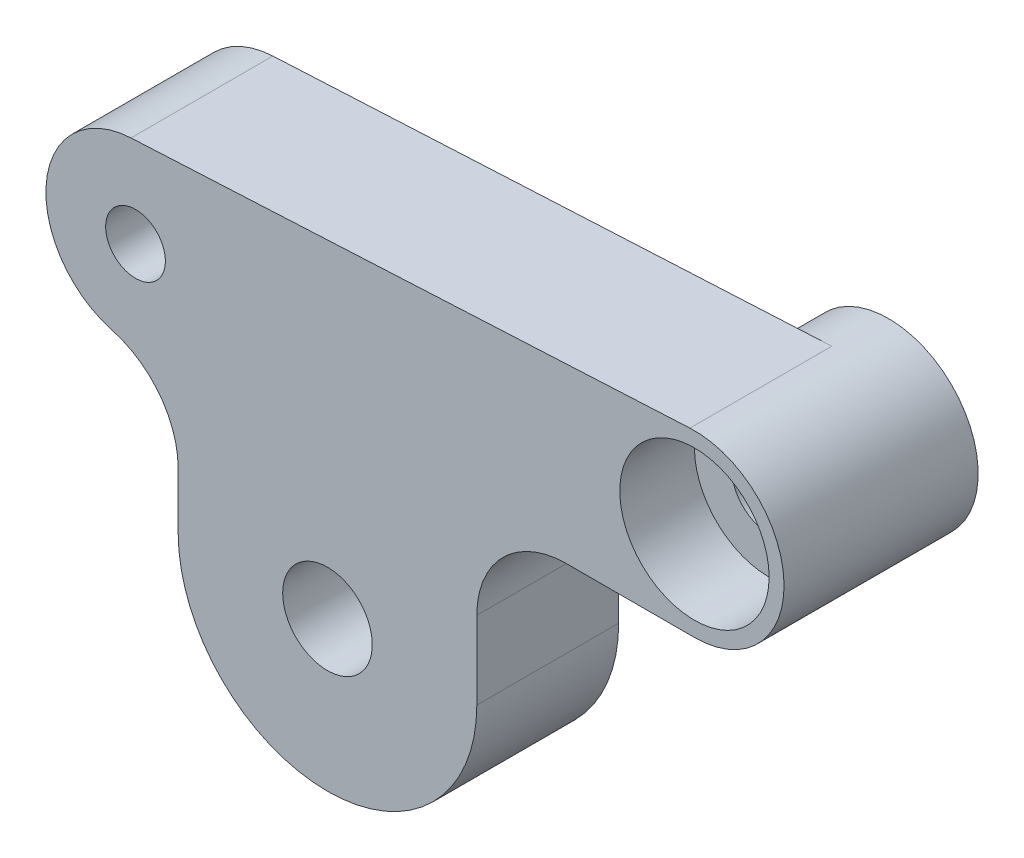
ISO-10303-21;
HEADER;
FILE_DESCRIPTION(('STEP AP214'),'2;1');
FILE_NAME('part.step','',(''),(''),'','','');
FILE_SCHEMA(('AUTOMOTIVE_DESIGN { 1 0 10303 214 1 1 1 1 }'));
ENDSEC;
DATA;
#1=APPLICATION_CONTEXT('core data for automotive mechanical design processes');
#2=APPLICATION_PROTOCOL_DEFINITION('international standard','automotive_design',2000,#1);
#3=PRODUCT_CONTEXT('',#1,'mechanical');
#4=PRODUCT('Part','Part','',(#3));
#5=PRODUCT_RELATED_PRODUCT_CATEGORY('part','',(#4));
#6=PRODUCT_DEFINITION_FORMATION('','',#4);
#7=PRODUCT_DEFINITION_CONTEXT('part definition',#1,'design');
#8=PRODUCT_DEFINITION('design','',#6,#7);
#9=PRODUCT_DEFINITION_SHAPE('','',#8);
#10=(LENGTH_UNIT() NAMED_UNIT(*) SI_UNIT(.MILLI.,.METRE.));
#11=(NAMED_UNIT(*) PLANE_ANGLE_UNIT() SI_UNIT($,.RADIAN.));
#12=(NAMED_UNIT(*) SI_UNIT($,.STERADIAN.) SOLID_ANGLE_UNIT());
#13=UNCERTAINTY_MEASURE_WITH_UNIT(LENGTH_MEASURE(1.E-05),#10,'distance_accuracy_value','');
#14=(GEOMETRIC_REPRESENTATION_CONTEXT(3) GLOBAL_UNCERTAINTY_ASSIGNED_CONTEXT((#13)) GLOBAL_UNIT_ASSIGNED_CONTEXT((#10,
#11,#12)) REPRESENTATION_CONTEXT('',''));
#15=CARTESIAN_POINT('',(0.,0.,0.));
#16=DIRECTION('',(0.,0.,1.));
#17=DIRECTION('',(1.,0.,0.));
#18=AXIS2_PLACEMENT_3D('',#15,#16,#17);
#19=CARTESIAN_POINT('',(-12.8557521937228,15.3208888623776,9.5));
#20=DIRECTION('',(0.,0.,-1.));
#21=DIRECTION('',(-1.,0.,0.));
#22=AXIS2_PLACEMENT_3D('',#19,#20,#21);
#23=CYLINDRICAL_SURFACE('',#22,2.);
#24=CARTESIAN_POINT('',(-12.8557521937228,15.3208888623776,9.5));
#25=DIRECTION('',(0.,0.,-1.));
#26=DIRECTION('',(-1.,0.,0.));
#27=AXIS2_PLACEMENT_3D('',#24,#25,#26);
#28=CIRCLE('',#27,2.);
#29=CARTESIAN_POINT('',(-14.8557521937228,15.3208888623776,9.5));
#30=VERTEX_POINT('',#29);
#31=EDGE_CURVE('E198',#30,#30,#28,.T.);
#32=ORIENTED_EDGE('',*,*,#31,.F.);
#33=EDGE_LOOP('',(#32));
#34=FACE_BOUND('',#33,.T.);
#35=CARTESIAN_POINT('',(-12.8557521937228,15.3208888623776,6.));
#36=DIRECTION('',(0.,0.,-1.));
#37=DIRECTION('',(-1.,0.,0.));
#38=AXIS2_PLACEMENT_3D('',#35,#36,#37);
#39=CIRCLE('',#38,2.);
#40=CARTESIAN_POINT('',(-14.8557521937228,15.3208888623776,6.));
#41=VERTEX_POINT('',#40);
#42=EDGE_CURVE('E196',#41,#41,#39,.F.);
#43=ORIENTED_EDGE('',*,*,#42,.F.);
#44=EDGE_LOOP('',(#43));
#45=FACE_BOUND('',#44,.T.);
#46=ADVANCED_FACE('F49',(#34,#45),#23,.F.);
#47=CARTESIAN_POINT('',(0.,0.,9.5));
#48=DIRECTION('',(0.,0.,-1.));
#49=DIRECTION('',(-1.,0.,0.));
#50=AXIS2_PLACEMENT_3D('',#47,#48,#49);
#51=CYLINDRICAL_SURFACE('',#50,10.);
#52=CARTESIAN_POINT('',(0.,0.,0.));
#53=DIRECTION('',(0.,0.,1.));
#54=DIRECTION('',(1.,0.,0.));
#55=AXIS2_PLACEMENT_3D('',#52,#53,#54);
#56=CIRCLE('',#55,10.);
#57=CARTESIAN_POINT('',(-10.,0.,0.));
#58=VERTEX_POINT('',#57);
#59=CARTESIAN_POINT('',(10.,0.,0.));
#60=VERTEX_POINT('',#59);
#61=EDGE_CURVE('E159',#58,#60,#56,.T.);
#62=ORIENTED_EDGE('',*,*,#61,.T.);
#63=DIRECTION('',(0.,0.,-1.));
#64=VECTOR('',#63,1.);
#65=CARTESIAN_POINT('',(10.,0.,9.5));
#66=LINE('',#65,#64);
#67=CARTESIAN_POINT('',(10.,0.,9.5));
#68=VERTEX_POINT('',#67);
#69=EDGE_CURVE('E145',#68,#60,#66,.T.);
#70=ORIENTED_EDGE('',*,*,#69,.F.);
#71=CARTESIAN_POINT('',(0.,0.,9.5));
#72=DIRECTION('',(0.,0.,1.));
#73=DIRECTION('',(1.,0.,0.));
#74=AXIS2_PLACEMENT_3D('',#71,#72,#73);
#75=CIRCLE('',#74,10.);
#76=CARTESIAN_POINT('',(-10.,0.,9.5));
#77=VERTEX_POINT('',#76);
#78=EDGE_CURVE('E163',#77,#68,#75,.T.);
#79=ORIENTED_EDGE('',*,*,#78,.F.);
#80=DIRECTION('',(0.,0.,-1.));
#81=VECTOR('',#80,1.);
#82=CARTESIAN_POINT('',(-10.,0.,9.5));
#83=LINE('',#82,#81);
#84=EDGE_CURVE('E179',#77,#58,#83,.T.);
#85=ORIENTED_EDGE('',*,*,#84,.T.);
#86=EDGE_LOOP('',(#62,#70,#79,#85));
#87=FACE_BOUND('',#86,.T.);
#88=ADVANCED_FACE('F236',(#87),#51,.T.);
#89=CARTESIAN_POINT('',(10.,0.,9.5));
#90=DIRECTION('',(-1.,0.,0.));
#91=DIRECTION('',(0.,0.,1.));
#92=AXIS2_PLACEMENT_3D('',#89,#90,#91);
#93=PLANE('',#92);
#94=DIRECTION('',(0.,1.,0.));
#95=VECTOR('',#94,1.);
#96=CARTESIAN_POINT('',(10.,0.,0.));
#97=LINE('',#96,#95);
#98=CARTESIAN_POINT('',(10.,5.20729309053141,0.));
#99=VERTEX_POINT('',#98);
#100=EDGE_CURVE('E182',#60,#99,#97,.T.);
#101=ORIENTED_EDGE('',*,*,#100,.T.);
#102=DIRECTION('',(0.,0.,-1.));
#103=VECTOR('',#102,1.);
#104=CARTESIAN_POINT('',(10.,5.20729309053141,9.5));
#105=LINE('',#104,#103);
#106=CARTESIAN_POINT('',(10.,5.20729309053141,9.5));
#107=VERTEX_POINT('',#106);
#108=EDGE_CURVE('E64',#99,#107,#105,.F.);
#109=ORIENTED_EDGE('',*,*,#108,.T.);
#110=DIRECTION('',(0.,1.,0.));
#111=VECTOR('',#110,1.);
#112=CARTESIAN_POINT('',(10.,0.,9.5));
#113=LINE('',#112,#111);
#114=EDGE_CURVE('E166',#68,#107,#113,.T.);
#115=ORIENTED_EDGE('',*,*,#114,.F.);
#116=ORIENTED_EDGE('',*,*,#69,.T.);
#117=EDGE_LOOP('',(#101,#109,#115,#116));
#118=FACE_BOUND('',#117,.T.);
#119=ADVANCED_FACE('F244',(#118),#93,.F.);
#120=CARTESIAN_POINT('',(10.,11.2072930905314,9.5));
#121=DIRECTION('',(0.,1.,0.));
#122=DIRECTION('',(0.,0.,1.));
#123=AXIS2_PLACEMENT_3D('',#120,#121,#122);
#124=PLANE('',#123);
#125=DIRECTION('',(1.,0.,0.));
#126=VECTOR('',#125,1.);
#127=CARTESIAN_POINT('',(10.,11.2072930905314,9.5));
#128=LINE('',#127,#126);
#129=CARTESIAN_POINT('',(16.,11.2072930905314,9.5));
#130=VERTEX_POINT('',#129);
#131=CARTESIAN_POINT('',(24.5745613286697,11.2072930905314,9.5));
#132=VERTEX_POINT('',#131);
#133=EDGE_CURVE('E169',#130,#132,#128,.T.);
#134=ORIENTED_EDGE('',*,*,#133,.F.);
#135=DIRECTION('',(0.,0.,-1.));
#136=VECTOR('',#135,1.);
#137=CARTESIAN_POINT('',(16.,11.2072930905314,0.));
#138=LINE('',#137,#136);
#139=CARTESIAN_POINT('',(16.,11.2072930905314,0.));
#140=VERTEX_POINT('',#139);
#141=EDGE_CURVE('E202',#130,#140,#138,.T.);
#142=ORIENTED_EDGE('',*,*,#141,.T.);
#143=DIRECTION('',(1.,0.,0.));
#144=VECTOR('',#143,1.);
#145=CARTESIAN_POINT('',(10.,11.2072930905314,0.));
#146=LINE('',#145,#144);
#147=CARTESIAN_POINT('',(24.5745613286697,11.2072930905314,0.));
#148=VERTEX_POINT('',#147);
#149=EDGE_CURVE('E129',#140,#148,#146,.T.);
#150=ORIENTED_EDGE('',*,*,#149,.T.);
#151=DIRECTION('',(0.,0.,-1.));
#152=VECTOR('',#151,1.);
#153=CARTESIAN_POINT('',(24.5745613286697,11.2072930905314,9.5));
#154=LINE('',#153,#152);
#155=EDGE_CURVE('E138',#132,#148,#154,.T.);
#156=ORIENTED_EDGE('',*,*,#155,.F.);
#157=EDGE_LOOP('',(#134,#142,#150,#156));
#158=FACE_BOUND('',#157,.T.);
#159=ADVANCED_FACE('F301',(#158),#124,.F.);
#160=CARTESIAN_POINT('',(24.5745613286697,17.2072930905314,9.5));
#161=DIRECTION('',(0.,0.,-1.));
#162=DIRECTION('',(-1.,0.,0.));
#163=AXIS2_PLACEMENT_3D('',#160,#161,#162);
#164=CYLINDRICAL_SURFACE('',#163,6.);
#165=ORIENTED_EDGE('',*,*,#155,.T.);
#166=CARTESIAN_POINT('',(24.5745613286697,17.2072930905314,0.));
#167=DIRECTION('',(0.,0.,-1.));
#168=DIRECTION('',(-1.,0.,0.));
#169=AXIS2_PLACEMENT_3D('',#166,#167,#168);
#170=CIRCLE('',#169,6.00000000000195);
#171=CARTESIAN_POINT('',(24.2725580164583,23.19968777041,0.));
#172=VERTEX_POINT('',#171);
#173=EDGE_CURVE('E122',#148,#172,#170,.T.);
#174=ORIENTED_EDGE('',*,*,#173,.T.);
#175=DIRECTION('',(0.,0.,-1.));
#176=VECTOR('',#175,1.);
#177=CARTESIAN_POINT('',(24.2725580164584,23.199687770408,9.5));
#178=LINE('',#177,#176);
#179=CARTESIAN_POINT('',(24.2725580164584,23.199687770408,9.5));
#180=VERTEX_POINT('',#179);
#181=EDGE_CURVE('E133',#180,#172,#178,.T.);
#182=ORIENTED_EDGE('',*,*,#181,.F.);
#183=CARTESIAN_POINT('',(24.5745613286697,17.2072930905314,9.5));
#184=DIRECTION('',(0.,0.,1.));
#185=DIRECTION('',(-1.,0.,0.));
#186=AXIS2_PLACEMENT_3D('',#183,#184,#185);
#187=CIRCLE('',#186,6.);
#188=EDGE_CURVE('E171',#132,#180,#187,.T.);
#189=ORIENTED_EDGE('',*,*,#188,.F.);
#190=EDGE_LOOP('',(#165,#174,#182,#189));
#191=FACE_BOUND('',#190,.T.);
#192=CARTESIAN_POINT('',(24.5745613286697,17.2072930905314,-3.5));
#193=DIRECTION('',(0.,0.,-1.));
#194=DIRECTION('',(-1.,0.,0.));
#195=AXIS2_PLACEMENT_3D('',#192,#193,#194);
#196=CIRCLE('',#195,6.00000000000195);
#197=CARTESIAN_POINT('',(18.5745613286678,17.2072930905314,-3.5));
#198=VERTEX_POINT('',#197);
#199=EDGE_CURVE('E154',#198,#198,#196,.T.);
#200=ORIENTED_EDGE('',*,*,#199,.F.);
#201=EDGE_LOOP('',(#200));
#202=FACE_BOUND('',#201,.T.);
#203=ADVANCED_FACE('F141',(#191,#202),#164,.T.);
#204=CARTESIAN_POINT('',(24.2725580164584,23.199687770408,9.5));
#205=DIRECTION('',(0.0503338853685589,-0.9987324466461,0.));
#206=DIRECTION('',(0.9987324466461,0.0503338853685589,0.));
#207=AXIS2_PLACEMENT_3D('',#204,#205,#206);
#208=PLANE('',#207);
#209=DIRECTION('',(-0.9987324466461,-0.0503338853685589,0.));
#210=VECTOR('',#209,1.);
#211=CARTESIAN_POINT('',(24.2725580164584,23.199687770408,0.));
#212=LINE('',#211,#210);
#213=CARTESIAN_POINT('',(-13.1577555059422,21.3132835422561,0.));
#214=VERTEX_POINT('',#213);
#215=EDGE_CURVE('E117',#172,#214,#212,.T.);
#216=ORIENTED_EDGE('',*,*,#215,.T.);
#217=DIRECTION('',(0.,0.,-1.));
#218=VECTOR('',#217,1.);
#219=CARTESIAN_POINT('',(-13.1577555059422,21.3132835422561,9.5));
#220=LINE('',#219,#218);
#221=CARTESIAN_POINT('',(-13.1577555059422,21.3132835422561,9.5));
#222=VERTEX_POINT('',#221);
#223=EDGE_CURVE('E139',#222,#214,#220,.T.);
#224=ORIENTED_EDGE('',*,*,#223,.F.);
#225=DIRECTION('',(-0.9987324466461,-0.0503338853685589,0.));
#226=VECTOR('',#225,1.);
#227=CARTESIAN_POINT('',(24.2725580164584,23.199687770408,9.5));
#228=LINE('',#227,#226);
#229=EDGE_CURVE('E135',#180,#222,#228,.T.);
#230=ORIENTED_EDGE('',*,*,#229,.F.);
#231=ORIENTED_EDGE('',*,*,#181,.T.);
#232=EDGE_LOOP('',(#216,#224,#230,#231));
#233=FACE_BOUND('',#232,.T.);
#234=ADVANCED_FACE('F134',(#233),#208,.F.);
#235=CARTESIAN_POINT('',(-12.8557521937309,15.3208888623795,9.5));
#236=DIRECTION('',(0.,0.,-1.));
#237=DIRECTION('',(-1.,0.,0.));
#238=AXIS2_PLACEMENT_3D('',#235,#236,#237);
#239=CYLINDRICAL_SURFACE('',#238,5.99999999999999);
#240=CARTESIAN_POINT('',(-12.8557521937309,15.3208888623795,0.));
#241=DIRECTION('',(0.,0.,1.));
#242=DIRECTION('',(1.,0.,0.));
#243=AXIS2_PLACEMENT_3D('',#240,#241,#242);
#244=CIRCLE('',#243,5.99999999999999);
#245=CARTESIAN_POINT('',(-14.4278760968654,9.53051526189455,0.));
#246=VERTEX_POINT('',#245);
#247=EDGE_CURVE('E125',#214,#246,#244,.T.);
#248=ORIENTED_EDGE('',*,*,#247,.T.);
#249=DIRECTION('',(0.,0.,-1.));
#250=VECTOR('',#249,1.);
#251=CARTESIAN_POINT('',(-14.4278760968654,9.53051526189455,9.5));
#252=LINE('',#251,#250);
#253=CARTESIAN_POINT('',(-14.4278760968654,9.53051526189455,9.5));
#254=VERTEX_POINT('',#253);
#255=EDGE_CURVE('E148',#246,#254,#252,.F.);
#256=ORIENTED_EDGE('',*,*,#255,.T.);
#257=CARTESIAN_POINT('',(-12.8557521937309,15.3208888623795,9.5));
#258=DIRECTION('',(0.,0.,1.));
#259=DIRECTION('',(1.,0.,0.));
#260=AXIS2_PLACEMENT_3D('',#257,#258,#259);
#261=CIRCLE('',#260,5.99999999999999);
#262=EDGE_CURVE('E174',#222,#254,#261,.T.);
#263=ORIENTED_EDGE('',*,*,#262,.F.);
#264=ORIENTED_EDGE('',*,*,#223,.T.);
#265=EDGE_LOOP('',(#248,#256,#263,#264));
#266=FACE_BOUND('',#265,.T.);
#267=ADVANCED_FACE('F225',(#266),#239,.T.);
#268=CARTESIAN_POINT('',(-10.,0.,9.5));
#269=DIRECTION('',(1.,0.,0.));
#270=DIRECTION('',(0.,0.,-1.));
#271=AXIS2_PLACEMENT_3D('',#268,#269,#270);
#272=PLANE('',#271);
#273=DIRECTION('',(0.,-1.,0.));
#274=VECTOR('',#273,1.);
#275=CARTESIAN_POINT('',(-10.,0.,9.5));
#276=LINE('',#275,#274);
#277=CARTESIAN_POINT('',(-10.,3.74014166140961,9.5));
#278=VERTEX_POINT('',#277);
#279=EDGE_CURVE('E177',#278,#77,#276,.T.);
#280=ORIENTED_EDGE('',*,*,#279,.F.);
#281=DIRECTION('',(0.,0.,1.));
#282=VECTOR('',#281,1.);
#283=CARTESIAN_POINT('',(-10.,3.74014166140961,0.));
#284=LINE('',#283,#282);
#285=CARTESIAN_POINT('',(-10.,3.74014166140961,0.));
#286=VERTEX_POINT('',#285);
#287=EDGE_CURVE('E144',#278,#286,#284,.F.);
#288=ORIENTED_EDGE('',*,*,#287,.T.);
#289=DIRECTION('',(0.,-1.,0.));
#290=VECTOR('',#289,1.);
#291=CARTESIAN_POINT('',(-10.,0.,0.));
#292=LINE('',#291,#290);
#293=EDGE_CURVE('E167',#286,#58,#292,.T.);
#294=ORIENTED_EDGE('',*,*,#293,.T.);
#295=ORIENTED_EDGE('',*,*,#84,.F.);
#296=EDGE_LOOP('',(#280,#288,#294,#295));
#297=FACE_BOUND('',#296,.T.);
#298=ADVANCED_FACE('F219',(#297),#272,.F.);
#299=CARTESIAN_POINT('',(0.,0.,9.5));
#300=DIRECTION('',(0.,0.,1.));
#301=DIRECTION('',(1.,0.,0.));
#302=AXIS2_PLACEMENT_3D('',#299,#300,#301);
#303=PLANE('',#302);
#304=ORIENTED_EDGE('',*,*,#31,.T.);
#305=EDGE_LOOP('',(#304));
#306=FACE_BOUND('',#305,.T.);
#307=CARTESIAN_POINT('',(24.5745613286697,17.2072930905314,9.5));
#308=DIRECTION('',(0.,0.,1.));
#309=DIRECTION('',(1.,0.,0.));
#310=AXIS2_PLACEMENT_3D('',#307,#308,#309);
#311=CIRCLE('',#310,5.0000000000034);
#312=CARTESIAN_POINT('',(29.5745613286731,17.2072930905314,9.5));
#313=VERTEX_POINT('',#312);
#314=EDGE_CURVE('E290',#313,#313,#311,.T.);
#315=ORIENTED_EDGE('',*,*,#314,.F.);
#316=EDGE_LOOP('',(#315));
#317=FACE_BOUND('',#316,.T.);
#318=CARTESIAN_POINT('',(0.,0.,9.5));
#319=DIRECTION('',(0.,0.,-1.));
#320=DIRECTION('',(-1.,0.,0.));
#321=AXIS2_PLACEMENT_3D('',#318,#319,#320);
#322=CIRCLE('',#321,3.00000000000001);
#323=CARTESIAN_POINT('',(-2.99999999999999,0.,9.5));
#324=VERTEX_POINT('',#323);
#325=EDGE_CURVE('E156',#324,#324,#322,.T.);
#326=ORIENTED_EDGE('',*,*,#325,.T.);
#327=EDGE_LOOP('',(#326));
#328=FACE_BOUND('',#327,.T.);
#329=ORIENTED_EDGE('',*,*,#78,.T.);
#330=ORIENTED_EDGE('',*,*,#114,.T.);
#331=CARTESIAN_POINT('',(16.,5.20729309053141,9.5));
#332=DIRECTION('',(0.,0.,1.));
#333=DIRECTION('',(1.,0.,0.));
#334=AXIS2_PLACEMENT_3D('',#331,#332,#333);
#335=CIRCLE('',#334,6.);
#336=EDGE_CURVE('E12',#107,#130,#335,.F.);
#337=ORIENTED_EDGE('',*,*,#336,.T.);
#338=ORIENTED_EDGE('',*,*,#133,.T.);
#339=ORIENTED_EDGE('',*,*,#188,.T.);
#340=ORIENTED_EDGE('',*,*,#229,.T.);
#341=ORIENTED_EDGE('',*,*,#262,.T.);
#342=CARTESIAN_POINT('',(-16.,3.74014166140961,9.5));
#343=DIRECTION('',(0.,0.,1.));
#344=DIRECTION('',(1.,0.,0.));
#345=AXIS2_PLACEMENT_3D('',#342,#343,#344);
#346=CIRCLE('',#345,6.);
#347=EDGE_CURVE('E208',#254,#278,#346,.F.);
#348=ORIENTED_EDGE('',*,*,#347,.T.);
#349=ORIENTED_EDGE('',*,*,#279,.T.);
#350=EDGE_LOOP('',(#329,#330,#337,#338,#339,#340,#341,#348,#349));
#351=FACE_BOUND('',#350,.T.);
#352=ADVANCED_FACE('F212',(#306,#317,#328,#351),#303,.T.);
#353=CARTESIAN_POINT('',(0.,0.,0.));
#354=DIRECTION('',(0.,0.,1.));
#355=DIRECTION('',(1.,0.,0.));
#356=AXIS2_PLACEMENT_3D('',#353,#354,#355);
#357=PLANE('',#356);
#358=CARTESIAN_POINT('',(-12.8557521937288,15.3208888623818,0.));
#359=DIRECTION('',(0.,0.,-1.));
#360=DIRECTION('',(-1.,0.,0.));
#361=AXIS2_PLACEMENT_3D('',#358,#359,#360);
#362=CIRCLE('',#361,4.);
#363=CARTESIAN_POINT('',(-16.8557521937288,15.3208888623818,0.));
#364=VERTEX_POINT('',#363);
#365=EDGE_CURVE('E282',#364,#364,#362,.T.);
#366=ORIENTED_EDGE('',*,*,#365,.F.);
#367=EDGE_LOOP('',(#366));
#368=FACE_BOUND('',#367,.T.);
#369=ORIENTED_EDGE('',*,*,#173,.F.);
#370=ORIENTED_EDGE('',*,*,#149,.F.);
#371=CARTESIAN_POINT('',(16.,5.20729309053141,0.));
#372=DIRECTION('',(0.,0.,1.));
#373=DIRECTION('',(1.,0.,0.));
#374=AXIS2_PLACEMENT_3D('',#371,#372,#373);
#375=CIRCLE('',#374,6.);
#376=EDGE_CURVE('E57',#140,#99,#375,.T.);
#377=ORIENTED_EDGE('',*,*,#376,.T.);
#378=ORIENTED_EDGE('',*,*,#100,.F.);
#379=ORIENTED_EDGE('',*,*,#61,.F.);
#380=ORIENTED_EDGE('',*,*,#293,.F.);
#381=CARTESIAN_POINT('',(-16.,3.74014166140961,0.));
#382=DIRECTION('',(0.,0.,1.));
#383=DIRECTION('',(1.,0.,0.));
#384=AXIS2_PLACEMENT_3D('',#381,#382,#383);
#385=CIRCLE('',#384,6.);
#386=EDGE_CURVE('E206',#286,#246,#385,.T.);
#387=ORIENTED_EDGE('',*,*,#386,.T.);
#388=ORIENTED_EDGE('',*,*,#247,.F.);
#389=ORIENTED_EDGE('',*,*,#215,.F.);
#390=EDGE_LOOP('',(#369,#370,#377,#378,#379,#380,#387,#388,#389));
#391=FACE_BOUND('',#390,.T.);
#392=CARTESIAN_POINT('',(0.,0.,0.));
#393=DIRECTION('',(0.,0.,-1.));
#394=DIRECTION('',(-1.,0.,0.));
#395=AXIS2_PLACEMENT_3D('',#392,#393,#394);
#396=CIRCLE('',#395,3.00000000000001);
#397=CARTESIAN_POINT('',(-2.99999999999999,0.,0.));
#398=VERTEX_POINT('',#397);
#399=EDGE_CURVE('E160',#398,#398,#396,.T.);
#400=ORIENTED_EDGE('',*,*,#399,.F.);
#401=EDGE_LOOP('',(#400));
#402=FACE_BOUND('',#401,.T.);
#403=ADVANCED_FACE('F119',(#368,#391,#402),#357,.F.);
#404=CARTESIAN_POINT('',(0.,0.,9.5));
#405=DIRECTION('',(0.,0.,-1.));
#406=DIRECTION('',(-1.,0.,0.));
#407=AXIS2_PLACEMENT_3D('',#404,#405,#406);
#408=CYLINDRICAL_SURFACE('',#407,3.00000000000001);
#409=ORIENTED_EDGE('',*,*,#325,.F.);
#410=EDGE_LOOP('',(#409));
#411=FACE_BOUND('',#410,.T.);
#412=ORIENTED_EDGE('',*,*,#399,.T.);
#413=EDGE_LOOP('',(#412));
#414=FACE_BOUND('',#413,.T.);
#415=ADVANCED_FACE('F268',(#411,#414),#408,.F.);
#416=CARTESIAN_POINT('',(24.5745613286697,17.2072930905314,-3.5));
#417=DIRECTION('',(0.,0.,-1.));
#418=DIRECTION('',(-1.,0.,0.));
#419=AXIS2_PLACEMENT_3D('',#416,#417,#418);
#420=PLANE('',#419);
#421=CARTESIAN_POINT('',(24.5745613286697,17.2072930905314,-3.5));
#422=DIRECTION('',(0.,0.,-1.));
#423=DIRECTION('',(-1.,0.,0.));
#424=AXIS2_PLACEMENT_3D('',#421,#422,#423);
#425=CIRCLE('',#424,2.50000000000916);
#426=CARTESIAN_POINT('',(22.0745613286606,17.2072930905314,-3.5));
#427=VERTEX_POINT('',#426);
#428=EDGE_CURVE('E194',#427,#427,#425,.T.);
#429=ORIENTED_EDGE('',*,*,#428,.F.);
#430=EDGE_LOOP('',(#429));
#431=FACE_BOUND('',#430,.T.);
#432=ORIENTED_EDGE('',*,*,#199,.T.);
#433=EDGE_LOOP('',(#432));
#434=FACE_BOUND('',#433,.T.);
#435=ADVANCED_FACE('F264',(#431,#434),#420,.T.);
#436=CARTESIAN_POINT('',(24.5745613286697,17.2072930905314,9.5));
#437=DIRECTION('',(0.,0.,-1.));
#438=DIRECTION('',(-1.,0.,0.));
#439=AXIS2_PLACEMENT_3D('',#436,#437,#438);
#440=CYLINDRICAL_SURFACE('',#439,2.50000000000916);
#441=CARTESIAN_POINT('',(24.5745613286697,17.2072930905314,4.5));
#442=DIRECTION('',(0.,0.,-1.));
#443=DIRECTION('',(-1.,0.,0.));
#444=AXIS2_PLACEMENT_3D('',#441,#442,#443);
#445=CIRCLE('',#444,2.50000000000916);
#446=CARTESIAN_POINT('',(22.0745613286606,17.2072930905314,4.5));
#447=VERTEX_POINT('',#446);
#448=EDGE_CURVE('E191',#447,#447,#445,.F.);
#449=CARTESIAN_POINT('',(22.0745613286606,17.2072930905314,4.5));
#450=CARTESIAN_POINT('',(22.0745613286606,17.2072930905314,4.41666666666667));
#451=CARTESIAN_POINT('',(22.0745613286606,17.2072930905314,4.33333333333333));
#452=CARTESIAN_POINT('',(22.0745613286606,17.2072930905314,4.16666666666667));
#453=CARTESIAN_POINT('',(22.0745613286606,17.2072930905314,4.08333333333333));
#454=CARTESIAN_POINT('',(22.0745613286606,17.2072930905314,3.91666666666667));
#455=CARTESIAN_POINT('',(22.0745613286606,17.2072930905314,3.83333333333333));
#456=CARTESIAN_POINT('',(22.0745613286606,17.2072930905314,3.66666666666667));
#457=CARTESIAN_POINT('',(22.0745613286606,17.2072930905314,3.58333333333333));
#458=CARTESIAN_POINT('',(22.0745613286606,17.2072930905314,3.41666666666667));
#459=CARTESIAN_POINT('',(22.0745613286606,17.2072930905314,3.33333333333333));
#460=CARTESIAN_POINT('',(22.0745613286606,17.2072930905314,3.16666666666667));
#461=CARTESIAN_POINT('',(22.0745613286606,17.2072930905314,3.08333333333333));
#462=CARTESIAN_POINT('',(22.0745613286606,17.2072930905314,2.91666666666667));
#463=CARTESIAN_POINT('',(22.0745613286606,17.2072930905314,2.83333333333333));
#464=CARTESIAN_POINT('',(22.0745613286606,17.2072930905314,2.66666666666667));
#465=CARTESIAN_POINT('',(22.0745613286606,17.2072930905314,2.58333333333333));
#466=CARTESIAN_POINT('',(22.0745613286606,17.2072930905314,2.41666666666667));
#467=CARTESIAN_POINT('',(22.0745613286606,17.2072930905314,2.33333333333333));
#468=CARTESIAN_POINT('',(22.0745613286606,17.2072930905314,2.16666666666667));
#469=CARTESIAN_POINT('',(22.0745613286606,17.2072930905314,2.08333333333333));
#470=CARTESIAN_POINT('',(22.0745613286606,17.2072930905314,1.91666666666667));
#471=CARTESIAN_POINT('',(22.0745613286606,17.2072930905314,1.83333333333333));
#472=CARTESIAN_POINT('',(22.0745613286606,17.2072930905314,1.66666666666667));
#473=CARTESIAN_POINT('',(22.0745613286606,17.2072930905314,1.58333333333333));
#474=CARTESIAN_POINT('',(22.0745613286606,17.2072930905314,1.41666666666667));
#475=CARTESIAN_POINT('',(22.0745613286606,17.2072930905314,1.33333333333333));
#476=CARTESIAN_POINT('',(22.0745613286606,17.2072930905314,1.16666666666667));
#477=CARTESIAN_POINT('',(22.0745613286606,17.2072930905314,1.08333333333333));
#478=CARTESIAN_POINT('',(22.0745613286606,17.2072930905314,0.916666666666668));
#479=CARTESIAN_POINT('',(22.0745613286606,17.2072930905314,0.833333333333334));
#480=CARTESIAN_POINT('',(22.0745613286606,17.2072930905314,0.666666666666667));
#481=CARTESIAN_POINT('',(22.0745613286606,17.2072930905314,0.583333333333334));
#482=CARTESIAN_POINT('',(22.0745613286606,17.2072930905314,0.416666666666667));
#483=CARTESIAN_POINT('',(22.0745613286606,17.2072930905314,0.333333333333334));
#484=CARTESIAN_POINT('',(22.0745613286606,17.2072930905314,0.166666666666667));
#485=CARTESIAN_POINT('',(22.0745613286606,17.2072930905314,0.0833333333333334));
#486=CARTESIAN_POINT('',(22.0745613286606,17.2072930905314,-0.0833333333333328));
#487=CARTESIAN_POINT('',(22.0745613286606,17.2072930905314,-0.166666666666666));
#488=CARTESIAN_POINT('',(22.0745613286606,17.2072930905314,-0.333333333333332));
#489=CARTESIAN_POINT('',(22.0745613286606,17.2072930905314,-0.416666666666665));
#490=CARTESIAN_POINT('',(22.0745613286606,17.2072930905314,-0.583333333333332));
#491=CARTESIAN_POINT('',(22.0745613286606,17.2072930905314,-0.666666666666666));
#492=CARTESIAN_POINT('',(22.0745613286606,17.2072930905314,-0.833333333333332));
#493=CARTESIAN_POINT('',(22.0745613286606,17.2072930905314,-0.916666666666666));
#494=CARTESIAN_POINT('',(22.0745613286606,17.2072930905314,-1.08333333333333));
#495=CARTESIAN_POINT('',(22.0745613286606,17.2072930905314,-1.16666666666667));
#496=CARTESIAN_POINT('',(22.0745613286606,17.2072930905314,-1.33333333333333));
#497=CARTESIAN_POINT('',(22.0745613286606,17.2072930905314,-1.41666666666667));
#498=CARTESIAN_POINT('',(22.0745613286606,17.2072930905314,-1.58333333333333));
#499=CARTESIAN_POINT('',(22.0745613286606,17.2072930905314,-1.66666666666667));
#500=CARTESIAN_POINT('',(22.0745613286606,17.2072930905314,-1.83333333333333));
#501=CARTESIAN_POINT('',(22.0745613286606,17.2072930905314,-1.91666666666666));
#502=CARTESIAN_POINT('',(22.0745613286606,17.2072930905314,-2.08333333333333));
#503=CARTESIAN_POINT('',(22.0745613286606,17.2072930905314,-2.16666666666667));
#504=CARTESIAN_POINT('',(22.0745613286606,17.2072930905314,-2.33333333333333));
#505=CARTESIAN_POINT('',(22.0745613286606,17.2072930905314,-2.41666666666667));
#506=CARTESIAN_POINT('',(22.0745613286606,17.2072930905314,-2.58333333333333));
#507=CARTESIAN_POINT('',(22.0745613286606,17.2072930905314,-2.66666666666667));
#508=CARTESIAN_POINT('',(22.0745613286606,17.2072930905314,-2.83333333333333));
#509=CARTESIAN_POINT('',(22.0745613286606,17.2072930905314,-2.91666666666667));
#510=CARTESIAN_POINT('',(22.0745613286606,17.2072930905314,-3.08333333333333));
#511=CARTESIAN_POINT('',(22.0745613286606,17.2072930905314,-3.16666666666667));
#512=CARTESIAN_POINT('',(22.0745613286606,17.2072930905314,-3.33333333333333));
#513=CARTESIAN_POINT('',(22.0745613286606,17.2072930905314,-3.41666666666667));
#514=CARTESIAN_POINT('',(22.0745613286606,17.2072930905314,-3.5));
#515=B_SPLINE_CURVE_WITH_KNOTS('',3,(#449,#450,#451,#452,#453,#454,#455,#456,#457,#458,#459,
#460,#461,#462,#463,#464,#465,#466,#467,#468,#469,#470,#471,#472,#473,#474,#475,#476,#477,#478,
#479,#480,#481,#482,#483,#484,#485,#486,#487,#488,#489,#490,#491,#492,#493,#494,#495,#496,#497,
#498,#499,#500,#501,#502,#503,#504,#505,#506,#507,#508,#509,#510,#511,#512,#513,#514),
.UNSPECIFIED.,.F.,.F.,(4,2,2,2,2,2,2,2,2,2,2,2,2,2,2,2,2,2,2,2,2,2,2,2,2,2,2,2,2,2,2,2,4),(0.,
0.25,0.5,0.750000000000001,1.,1.25,1.5,1.75,2.,2.25,2.5,2.75,3.,3.25,3.5,3.75,4.,4.25,4.5,4.75,
5.,5.25,5.5,5.75,6.,6.25,6.5,6.75,7.,7.25,7.5,7.75,8.),.UNSPECIFIED.);
#516=EDGE_CURVE('BSEAM260',#447,#427,#515,.T.);
#517=ORIENTED_EDGE('',*,*,#448,.T.);
#518=ORIENTED_EDGE('',*,*,#428,.T.);
#519=ORIENTED_EDGE('',*,*,#516,.T.);
#520=ORIENTED_EDGE('',*,*,#516,.F.);
#521=EDGE_LOOP('',(#517,#519,#518,#520));
#522=FACE_BOUND('',#521,.T.);
#523=ADVANCED_FACE('F260',(#522),#440,.F.);
#524=CARTESIAN_POINT('',(24.5745613286697,17.2072930905314,4.5));
#525=DIRECTION('',(0.,0.,-1.));
#526=DIRECTION('',(-1.,0.,0.));
#527=AXIS2_PLACEMENT_3D('',#524,#525,#526);
#528=PLANE('',#527);
#529=CARTESIAN_POINT('',(24.5745613286697,17.2072930905314,4.5));
#530=DIRECTION('',(0.,0.,-1.));
#531=DIRECTION('',(-1.,0.,0.));
#532=AXIS2_PLACEMENT_3D('',#529,#530,#531);
#533=CIRCLE('',#532,5.0000000000034);
#534=CARTESIAN_POINT('',(19.5745613286663,17.2072930905314,4.5));
#535=VERTEX_POINT('',#534);
#536=EDGE_CURVE('E195',#535,#535,#533,.F.);
#537=ORIENTED_EDGE('',*,*,#536,.T.);
#538=EDGE_LOOP('',(#537));
#539=FACE_BOUND('',#538,.T.);
#540=ORIENTED_EDGE('',*,*,#448,.F.);
#541=EDGE_LOOP('',(#540));
#542=FACE_BOUND('',#541,.T.);
#543=ADVANCED_FACE('F256',(#539,#542),#528,.F.);
#544=CARTESIAN_POINT('',(24.5745613286697,17.2072930905314,-17.6421356237406));
#545=DIRECTION('',(0.,0.,1.));
#546=DIRECTION('',(1.,0.,0.));
#547=AXIS2_PLACEMENT_3D('',#544,#545,#546);
#548=CYLINDRICAL_SURFACE('',#547,5.0000000000034);
#549=ORIENTED_EDGE('',*,*,#314,.T.);
#550=EDGE_LOOP('',(#549));
#551=FACE_BOUND('',#550,.T.);
#552=ORIENTED_EDGE('',*,*,#536,.F.);
#553=EDGE_LOOP('',(#552));
#554=FACE_BOUND('',#553,.T.);
#555=ADVANCED_FACE('F253',(#551,#554),#548,.F.);
#556=CARTESIAN_POINT('',(-12.8557521937288,15.3208888623818,6.));
#557=DIRECTION('',(0.,0.,-1.));
#558=DIRECTION('',(-1.,0.,0.));
#559=AXIS2_PLACEMENT_3D('',#556,#557,#558);
#560=PLANE('',#559);
#561=CARTESIAN_POINT('',(-12.8557521937288,15.3208888623818,6.));
#562=DIRECTION('',(0.,0.,-1.));
#563=DIRECTION('',(-1.,0.,0.));
#564=AXIS2_PLACEMENT_3D('',#561,#562,#563);
#565=CIRCLE('',#564,4.);
#566=CARTESIAN_POINT('',(-16.8557521937288,15.3208888623818,6.));
#567=VERTEX_POINT('',#566);
#568=EDGE_CURVE('E199',#567,#567,#565,.T.);
#569=ORIENTED_EDGE('',*,*,#568,.T.);
#570=EDGE_LOOP('',(#569));
#571=FACE_BOUND('',#570,.T.);
#572=ORIENTED_EDGE('',*,*,#42,.T.);
#573=EDGE_LOOP('',(#572));
#574=FACE_BOUND('',#573,.T.);
#575=ADVANCED_FACE('F255',(#571,#574),#560,.T.);
#576=CARTESIAN_POINT('',(-12.8557521937288,15.3208888623818,6.));
#577=DIRECTION('',(0.,0.,-1.));
#578=DIRECTION('',(-1.,0.,0.));
#579=AXIS2_PLACEMENT_3D('',#576,#577,#578);
#580=CYLINDRICAL_SURFACE('',#579,4.);
#581=ORIENTED_EDGE('',*,*,#568,.F.);
#582=EDGE_LOOP('',(#581));
#583=FACE_BOUND('',#582,.T.);
#584=ORIENTED_EDGE('',*,*,#365,.T.);
#585=EDGE_LOOP('',(#584));
#586=FACE_BOUND('',#585,.T.);
#587=ADVANCED_FACE('F251',(#583,#586),#580,.F.);
#588=CARTESIAN_POINT('',(-16.,3.74014166140961,9.5));
#589=DIRECTION('',(0.,0.,-1.));
#590=DIRECTION('',(-1.,0.,0.));
#591=AXIS2_PLACEMENT_3D('',#588,#589,#590);
#592=CYLINDRICAL_SURFACE('',#591,6.);
#593=ORIENTED_EDGE('',*,*,#347,.F.);
#594=ORIENTED_EDGE('',*,*,#255,.F.);
#595=ORIENTED_EDGE('',*,*,#386,.F.);
#596=ORIENTED_EDGE('',*,*,#287,.F.);
#597=EDGE_LOOP('',(#593,#594,#595,#596));
#598=FACE_BOUND('',#597,.T.);
#599=ADVANCED_FACE('F222',(#598),#592,.F.);
#600=CARTESIAN_POINT('',(16.,5.20729309053141,9.5));
#601=DIRECTION('',(0.,0.,1.));
#602=DIRECTION('',(1.,0.,0.));
#603=AXIS2_PLACEMENT_3D('',#600,#601,#602);
#604=CYLINDRICAL_SURFACE('',#603,6.);
#605=ORIENTED_EDGE('',*,*,#336,.F.);
#606=ORIENTED_EDGE('',*,*,#108,.F.);
#607=ORIENTED_EDGE('',*,*,#376,.F.);
#608=ORIENTED_EDGE('',*,*,#141,.F.);
#609=EDGE_LOOP('',(#605,#606,#607,#608));
#610=FACE_BOUND('',#609,.T.);
#611=ADVANCED_FACE('F51',(#610),#604,.F.);
#612=CLOSED_SHELL('',(#46,#88,#119,#159,#203,#234,#267,#298,#352,#403,#415,#435,#523,#543,#555,
#575,#587,#599,#611));
#613=MANIFOLD_SOLID_BREP('B2',#612);
#614=ADVANCED_BREP_SHAPE_REPRESENTATION('',(#18,#613),#14);
#615=SHAPE_DEFINITION_REPRESENTATION(#9,#614);
ENDSEC;
END-ISO-10303-21;
